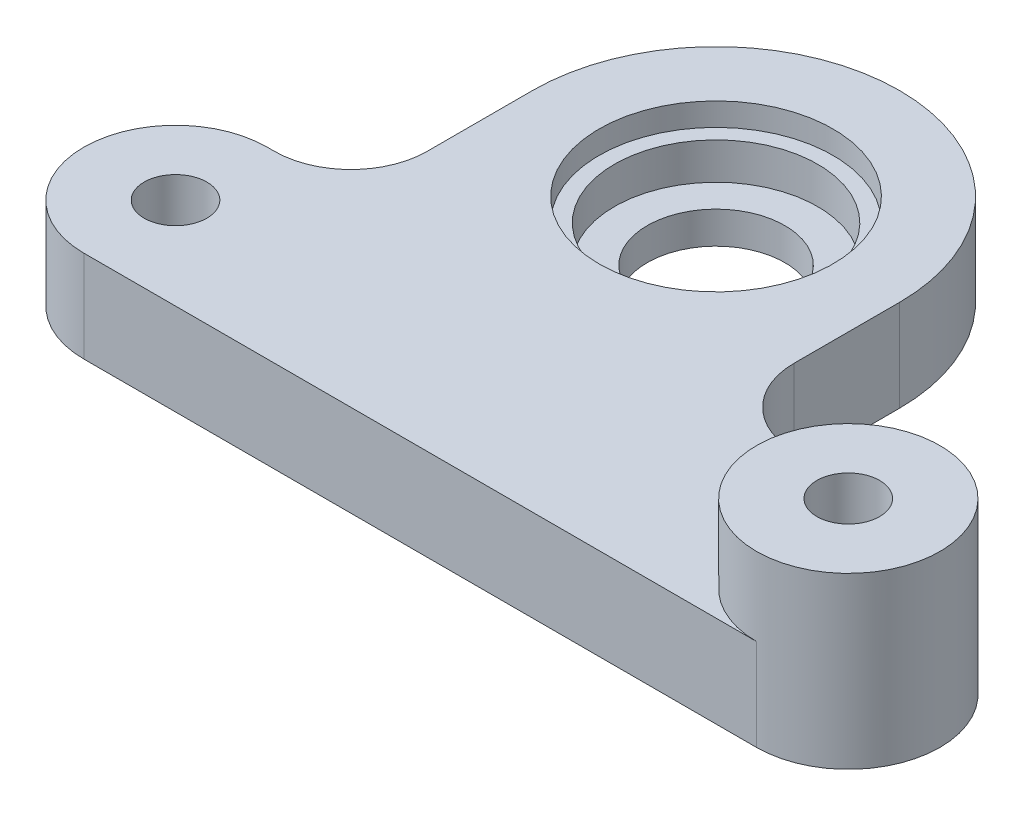
ISO-10303-21;
HEADER;
FILE_DESCRIPTION(('STEP AP214'),'2;1');
FILE_NAME('part.step','',(''),(''),'','','');
FILE_SCHEMA(('AUTOMOTIVE_DESIGN { 1 0 10303 214 1 1 1 1 }'));
ENDSEC;
DATA;
#1=APPLICATION_CONTEXT('core data for automotive mechanical design processes');
#2=APPLICATION_PROTOCOL_DEFINITION('international standard','automotive_design',2000,#1);
#3=PRODUCT_CONTEXT('',#1,'mechanical');
#4=PRODUCT('Part','Part','',(#3));
#5=PRODUCT_RELATED_PRODUCT_CATEGORY('part','',(#4));
#6=PRODUCT_DEFINITION_FORMATION('','',#4);
#7=PRODUCT_DEFINITION_CONTEXT('part definition',#1,'design');
#8=PRODUCT_DEFINITION('design','',#6,#7);
#9=PRODUCT_DEFINITION_SHAPE('','',#8);
#10=(LENGTH_UNIT() NAMED_UNIT(*) SI_UNIT(.MILLI.,.METRE.));
#11=(NAMED_UNIT(*) PLANE_ANGLE_UNIT() SI_UNIT($,.RADIAN.));
#12=(NAMED_UNIT(*) SI_UNIT($,.STERADIAN.) SOLID_ANGLE_UNIT());
#13=UNCERTAINTY_MEASURE_WITH_UNIT(LENGTH_MEASURE(1.E-05),#10,'distance_accuracy_value','');
#14=(GEOMETRIC_REPRESENTATION_CONTEXT(3) GLOBAL_UNCERTAINTY_ASSIGNED_CONTEXT((#13)) GLOBAL_UNIT_ASSIGNED_CONTEXT((#10,
#11,#12)) REPRESENTATION_CONTEXT('',''));
#15=CARTESIAN_POINT('',(0.,0.,0.));
#16=DIRECTION('',(0.,0.,1.));
#17=DIRECTION('',(1.,0.,0.));
#18=AXIS2_PLACEMENT_3D('',#15,#16,#17);
#19=CARTESIAN_POINT('',(3.29754031867881,2.1,-13.7904070793871));
#20=DIRECTION('',(0.,1.,0.));
#21=DIRECTION('',(0.,0.,1.));
#22=AXIS2_PLACEMENT_3D('',#19,#20,#21);
#23=CYLINDRICAL_SURFACE('',#22,6.65);
#24=CARTESIAN_POINT('',(3.29754031867881,2.1,-13.7904070793871));
#25=DIRECTION('',(0.,1.,0.));
#26=DIRECTION('',(0.,0.,1.));
#27=AXIS2_PLACEMENT_3D('',#24,#25,#26);
#28=CIRCLE('',#27,6.65);
#29=CARTESIAN_POINT('',(3.29754031867881,2.1,-7.14040707938713));
#30=VERTEX_POINT('',#29);
#31=EDGE_CURVE('E197',#30,#30,#28,.T.);
#32=ORIENTED_EDGE('',*,*,#31,.F.);
#33=EDGE_LOOP('',(#32));
#34=FACE_BOUND('',#33,.T.);
#35=CARTESIAN_POINT('',(3.29754031867881,4.5,-13.7904070793871));
#36=DIRECTION('',(0.,1.,0.));
#37=DIRECTION('',(0.,0.,1.));
#38=AXIS2_PLACEMENT_3D('',#35,#36,#37);
#39=CIRCLE('',#38,6.65);
#40=CARTESIAN_POINT('',(3.29754031867881,4.5,-7.14040707938713));
#41=VERTEX_POINT('',#40);
#42=EDGE_CURVE('E39',#41,#41,#39,.F.);
#43=ORIENTED_EDGE('',*,*,#42,.F.);
#44=EDGE_LOOP('',(#43));
#45=FACE_BOUND('',#44,.T.);
#46=ADVANCED_FACE('F35',(#34,#45),#23,.F.);
#47=CARTESIAN_POINT('',(3.29754031867881,6.,-13.7904070793871));
#48=DIRECTION('',(0.,-1.,0.));
#49=DIRECTION('',(0.,0.,-1.));
#50=AXIS2_PLACEMENT_3D('',#47,#48,#49);
#51=CYLINDRICAL_SURFACE('',#50,4.5);
#52=CARTESIAN_POINT('',(3.29754031867881,0.,-13.7904070793871));
#53=DIRECTION('',(0.,1.,0.));
#54=DIRECTION('',(0.,0.,1.));
#55=AXIS2_PLACEMENT_3D('',#52,#53,#54);
#56=CIRCLE('',#55,4.5);
#57=CARTESIAN_POINT('',(3.29754031867881,0.,-9.29040707938713));
#58=VERTEX_POINT('',#57);
#59=EDGE_CURVE('E152',#58,#58,#56,.T.);
#60=ORIENTED_EDGE('',*,*,#59,.F.);
#61=EDGE_LOOP('',(#60));
#62=FACE_BOUND('',#61,.T.);
#63=CARTESIAN_POINT('',(3.29754031867881,2.1,-13.7904070793871));
#64=DIRECTION('',(0.,1.,0.));
#65=DIRECTION('',(0.,0.,1.));
#66=AXIS2_PLACEMENT_3D('',#63,#64,#65);
#67=CIRCLE('',#66,4.5);
#68=CARTESIAN_POINT('',(3.29754031867881,2.1,-9.29040707938713));
#69=VERTEX_POINT('',#68);
#70=EDGE_CURVE('E194',#69,#69,#67,.T.);
#71=ORIENTED_EDGE('',*,*,#70,.T.);
#72=EDGE_LOOP('',(#71));
#73=FACE_BOUND('',#72,.T.);
#74=ADVANCED_FACE('F263',(#62,#73),#51,.F.);
#75=CARTESIAN_POINT('',(-14.1683687722303,6.,4.09651606653429));
#76=DIRECTION('',(0.,-1.,0.));
#77=DIRECTION('',(0.,0.,-1.));
#78=AXIS2_PLACEMENT_3D('',#75,#76,#77);
#79=CYLINDRICAL_SURFACE('',#78,2.05);
#80=CARTESIAN_POINT('',(-14.1683687722303,6.,4.09651606653429));
#81=DIRECTION('',(0.,1.,0.));
#82=DIRECTION('',(0.,0.,1.));
#83=AXIS2_PLACEMENT_3D('',#80,#81,#82);
#84=CIRCLE('',#83,2.05);
#85=CARTESIAN_POINT('',(-14.1683687722303,6.,6.14651606653429));
#86=VERTEX_POINT('',#85);
#87=EDGE_CURVE('E193',#86,#86,#84,.T.);
#88=ORIENTED_EDGE('',*,*,#87,.T.);
#89=EDGE_LOOP('',(#88));
#90=FACE_BOUND('',#89,.T.);
#91=CARTESIAN_POINT('',(-14.1683687722303,2.,4.09651606653429));
#92=DIRECTION('',(0.,-1.,0.));
#93=DIRECTION('',(0.,0.,-1.));
#94=AXIS2_PLACEMENT_3D('',#91,#92,#93);
#95=CIRCLE('',#94,2.05);
#96=CARTESIAN_POINT('',(-14.1683687722303,2.,2.04651606653429));
#97=VERTEX_POINT('',#96);
#98=EDGE_CURVE('E190',#97,#97,#95,.T.);
#99=ORIENTED_EDGE('',*,*,#98,.T.);
#100=EDGE_LOOP('',(#99));
#101=FACE_BOUND('',#100,.T.);
#102=ADVANCED_FACE('F269',(#90,#101),#79,.F.);
#103=CARTESIAN_POINT('',(29.8316312277697,6.,4.09651606653429));
#104=DIRECTION('',(0.,-1.,0.));
#105=DIRECTION('',(0.,0.,-1.));
#106=AXIS2_PLACEMENT_3D('',#103,#104,#105);
#107=CYLINDRICAL_SURFACE('',#106,2.04999999999999);
#108=CARTESIAN_POINT('',(29.8316312277697,2.,4.09651606653429));
#109=DIRECTION('',(0.,-1.,0.));
#110=DIRECTION('',(0.,0.,-1.));
#111=AXIS2_PLACEMENT_3D('',#108,#109,#110);
#112=CIRCLE('',#111,2.04999999999999);
#113=CARTESIAN_POINT('',(29.8316312277697,2.,2.0465160665343));
#114=VERTEX_POINT('',#113);
#115=EDGE_CURVE('E187',#114,#114,#112,.T.);
#116=ORIENTED_EDGE('',*,*,#115,.T.);
#117=EDGE_LOOP('',(#116));
#118=FACE_BOUND('',#117,.T.);
#119=CARTESIAN_POINT('',(29.8316312277697,11.1,4.09651606653429));
#120=DIRECTION('',(0.,1.,0.));
#121=DIRECTION('',(0.,0.,1.));
#122=AXIS2_PLACEMENT_3D('',#119,#120,#121);
#123=CIRCLE('',#122,2.04999999999999);
#124=CARTESIAN_POINT('',(29.8316312277697,11.1,6.14651606653427));
#125=VERTEX_POINT('',#124);
#126=EDGE_CURVE('E461',#125,#125,#123,.T.);
#127=ORIENTED_EDGE('',*,*,#126,.T.);
#128=EDGE_LOOP('',(#127));
#129=FACE_BOUND('',#128,.T.);
#130=ADVANCED_FACE('F288',(#118,#129),#107,.F.);
#131=CARTESIAN_POINT('',(-14.1683687722303,6.,4.09651606653429));
#132=DIRECTION('',(0.,1.,0.));
#133=DIRECTION('',(0.,0.,1.));
#134=AXIS2_PLACEMENT_3D('',#131,#132,#133);
#135=PLANE('',#134);
#136=CARTESIAN_POINT('',(29.8316312277697,6.,4.09651606653429));
#137=DIRECTION('',(0.,1.,0.));
#138=DIRECTION('',(0.,0.,1.));
#139=AXIS2_PLACEMENT_3D('',#136,#137,#138);
#140=CIRCLE('',#139,5.99999999999999);
#141=CARTESIAN_POINT('',(29.8316312277697,6.,-1.90348393346571));
#142=VERTEX_POINT('',#141);
#143=CARTESIAN_POINT('',(29.8316312277697,6.,10.0965160665343));
#144=VERTEX_POINT('',#143);
#145=EDGE_CURVE('E11',#142,#144,#140,.T.);
#146=ORIENTED_EDGE('',*,*,#145,.F.);
#147=DIRECTION('',(-1.,0.,0.));
#148=VECTOR('',#147,1.);
#149=CARTESIAN_POINT('',(20.2975403186788,6.,-1.90348393346571));
#150=LINE('',#149,#148);
#151=CARTESIAN_POINT('',(20.2975403186788,6.,-1.90348393346571));
#152=VERTEX_POINT('',#151);
#153=EDGE_CURVE('E226',#142,#152,#150,.T.);
#154=ORIENTED_EDGE('',*,*,#153,.T.);
#155=CARTESIAN_POINT('',(20.2975403186788,6.,-6.90348393346571));
#156=DIRECTION('',(0.,-1.,0.));
#157=DIRECTION('',(0.,0.,-1.));
#158=AXIS2_PLACEMENT_3D('',#155,#156,#157);
#159=CIRCLE('',#158,5.);
#160=CARTESIAN_POINT('',(15.2975403186788,6.,-6.90348393346571));
#161=VERTEX_POINT('',#160);
#162=EDGE_CURVE('E228',#152,#161,#159,.T.);
#163=ORIENTED_EDGE('',*,*,#162,.T.);
#164=DIRECTION('',(0.,0.,-1.));
#165=VECTOR('',#164,1.);
#166=CARTESIAN_POINT('',(15.2975403186788,6.,-13.7904070793871));
#167=LINE('',#166,#165);
#168=CARTESIAN_POINT('',(15.2975403186788,6.,-13.7904070793871));
#169=VERTEX_POINT('',#168);
#170=EDGE_CURVE('E230',#161,#169,#167,.T.);
#171=ORIENTED_EDGE('',*,*,#170,.T.);
#172=CARTESIAN_POINT('',(3.29754031867881,6.,-13.7904070793871));
#173=DIRECTION('',(0.,1.,0.));
#174=DIRECTION('',(0.,0.,1.));
#175=AXIS2_PLACEMENT_3D('',#172,#173,#174);
#176=CIRCLE('',#175,12.);
#177=CARTESIAN_POINT('',(-8.70245968132119,6.,-13.7904070793871));
#178=VERTEX_POINT('',#177);
#179=EDGE_CURVE('E130',#169,#178,#176,.T.);
#180=ORIENTED_EDGE('',*,*,#179,.T.);
#181=DIRECTION('',(0.,0.,1.));
#182=VECTOR('',#181,1.);
#183=CARTESIAN_POINT('',(-8.70245968132119,6.,-13.7904070793871));
#184=LINE('',#183,#182);
#185=CARTESIAN_POINT('',(-8.70245968132119,6.,-6.90348393346571));
#186=VERTEX_POINT('',#185);
#187=EDGE_CURVE('E123',#178,#186,#184,.T.);
#188=ORIENTED_EDGE('',*,*,#187,.T.);
#189=CARTESIAN_POINT('',(-13.7024596813212,6.,-6.90348393346571));
#190=DIRECTION('',(0.,-1.,0.));
#191=DIRECTION('',(0.,0.,-1.));
#192=AXIS2_PLACEMENT_3D('',#189,#190,#191);
#193=CIRCLE('',#192,5.);
#194=CARTESIAN_POINT('',(-13.7024596813212,6.,-1.90348393346571));
#195=VERTEX_POINT('',#194);
#196=EDGE_CURVE('E128',#186,#195,#193,.T.);
#197=ORIENTED_EDGE('',*,*,#196,.T.);
#198=DIRECTION('',(-1.,0.,0.));
#199=VECTOR('',#198,1.);
#200=CARTESIAN_POINT('',(-13.7024596813212,6.,-1.90348393346571));
#201=LINE('',#200,#199);
#202=CARTESIAN_POINT('',(-14.1683687722303,6.,-1.90348393346571));
#203=VERTEX_POINT('',#202);
#204=EDGE_CURVE('E54',#195,#203,#201,.T.);
#205=ORIENTED_EDGE('',*,*,#204,.T.);
#206=CARTESIAN_POINT('',(-14.1683687722303,6.,4.09651606653429));
#207=DIRECTION('',(0.,1.,0.));
#208=DIRECTION('',(0.,0.,1.));
#209=AXIS2_PLACEMENT_3D('',#206,#207,#208);
#210=CIRCLE('',#209,6.);
#211=CARTESIAN_POINT('',(-14.1683687722303,6.,10.0965160665343));
#212=VERTEX_POINT('',#211);
#213=EDGE_CURVE('E167',#203,#212,#210,.T.);
#214=ORIENTED_EDGE('',*,*,#213,.T.);
#215=DIRECTION('',(1.,0.,0.));
#216=VECTOR('',#215,1.);
#217=CARTESIAN_POINT('',(-14.1683687722303,6.,10.0965160665343));
#218=LINE('',#217,#216);
#219=EDGE_CURVE('E105',#212,#144,#218,.T.);
#220=ORIENTED_EDGE('',*,*,#219,.T.);
#221=EDGE_LOOP('',(#146,#154,#163,#171,#180,#188,#197,#205,#214,#220));
#222=FACE_BOUND('',#221,.T.);
#223=CARTESIAN_POINT('',(3.29754031867881,6.,-13.7904070793871));
#224=DIRECTION('',(0.,1.,0.));
#225=DIRECTION('',(0.,0.,1.));
#226=AXIS2_PLACEMENT_3D('',#223,#224,#225);
#227=CIRCLE('',#226,7.65);
#228=CARTESIAN_POINT('',(3.29754031867881,6.,-6.14040707938713));
#229=VERTEX_POINT('',#228);
#230=EDGE_CURVE('E211',#229,#229,#227,.T.);
#231=ORIENTED_EDGE('',*,*,#230,.F.);
#232=EDGE_LOOP('',(#231));
#233=FACE_BOUND('',#232,.T.);
#234=ORIENTED_EDGE('',*,*,#87,.F.);
#235=EDGE_LOOP('',(#234));
#236=FACE_BOUND('',#235,.T.);
#237=ADVANCED_FACE('F125',(#222,#233,#236),#135,.T.);
#238=CARTESIAN_POINT('',(-14.1683687722303,0.,4.09651606653429));
#239=DIRECTION('',(0.,1.,0.));
#240=DIRECTION('',(0.,0.,1.));
#241=AXIS2_PLACEMENT_3D('',#238,#239,#240);
#242=PLANE('',#241);
#243=CARTESIAN_POINT('',(-14.1683687722303,0.,4.09651606653429));
#244=DIRECTION('',(0.,-1.,0.));
#245=DIRECTION('',(0.,0.,-1.));
#246=AXIS2_PLACEMENT_3D('',#243,#244,#245);
#247=CIRCLE('',#246,4.);
#248=CARTESIAN_POINT('',(-14.1683687722303,0.,0.0965160665342881));
#249=VERTEX_POINT('',#248);
#250=EDGE_CURVE('E215',#249,#249,#247,.T.);
#251=ORIENTED_EDGE('',*,*,#250,.F.);
#252=EDGE_LOOP('',(#251));
#253=FACE_BOUND('',#252,.T.);
#254=CARTESIAN_POINT('',(29.8316312277697,0.,4.09651606653429));
#255=DIRECTION('',(0.,-1.,0.));
#256=DIRECTION('',(0.,0.,-1.));
#257=AXIS2_PLACEMENT_3D('',#254,#255,#256);
#258=CIRCLE('',#257,4.00000000000001);
#259=CARTESIAN_POINT('',(29.8316312277697,0.,0.096516066534282));
#260=VERTEX_POINT('',#259);
#261=EDGE_CURVE('E196',#260,#260,#258,.T.);
#262=ORIENTED_EDGE('',*,*,#261,.F.);
#263=EDGE_LOOP('',(#262));
#264=FACE_BOUND('',#263,.T.);
#265=CARTESIAN_POINT('',(-14.1683687722303,0.,4.09651606653429));
#266=DIRECTION('',(0.,1.,0.));
#267=DIRECTION('',(0.,0.,1.));
#268=AXIS2_PLACEMENT_3D('',#265,#266,#267);
#269=CIRCLE('',#268,6.);
#270=CARTESIAN_POINT('',(-14.1683687722303,0.,-1.90348393346571));
#271=VERTEX_POINT('',#270);
#272=CARTESIAN_POINT('',(-14.1683687722303,0.,10.0965160665343));
#273=VERTEX_POINT('',#272);
#274=EDGE_CURVE('E148',#271,#273,#269,.T.);
#275=ORIENTED_EDGE('',*,*,#274,.F.);
#276=DIRECTION('',(-1.,0.,0.));
#277=VECTOR('',#276,1.);
#278=CARTESIAN_POINT('',(-13.7024596813212,0.,-1.90348393346571));
#279=LINE('',#278,#277);
#280=CARTESIAN_POINT('',(-13.7024596813212,0.,-1.90348393346571));
#281=VERTEX_POINT('',#280);
#282=EDGE_CURVE('E96',#281,#271,#279,.T.);
#283=ORIENTED_EDGE('',*,*,#282,.F.);
#284=CARTESIAN_POINT('',(-13.7024596813212,0.,-6.90348393346571));
#285=DIRECTION('',(0.,-1.,0.));
#286=DIRECTION('',(0.,0.,-1.));
#287=AXIS2_PLACEMENT_3D('',#284,#285,#286);
#288=CIRCLE('',#287,5.);
#289=CARTESIAN_POINT('',(-8.70245968132119,0.,-6.90348393346571));
#290=VERTEX_POINT('',#289);
#291=EDGE_CURVE('E90',#290,#281,#288,.T.);
#292=ORIENTED_EDGE('',*,*,#291,.F.);
#293=DIRECTION('',(0.,0.,1.));
#294=VECTOR('',#293,1.);
#295=CARTESIAN_POINT('',(-8.70245968132119,0.,-13.7904070793871));
#296=LINE('',#295,#294);
#297=CARTESIAN_POINT('',(-8.70245968132119,0.,-13.7904070793871));
#298=VERTEX_POINT('',#297);
#299=EDGE_CURVE('E138',#298,#290,#296,.T.);
#300=ORIENTED_EDGE('',*,*,#299,.F.);
#301=CARTESIAN_POINT('',(3.29754031867881,0.,-13.7904070793871));
#302=DIRECTION('',(0.,1.,0.));
#303=DIRECTION('',(0.,0.,1.));
#304=AXIS2_PLACEMENT_3D('',#301,#302,#303);
#305=CIRCLE('',#304,12.);
#306=CARTESIAN_POINT('',(15.2975403186788,0.,-13.7904070793871));
#307=VERTEX_POINT('',#306);
#308=EDGE_CURVE('E162',#307,#298,#305,.T.);
#309=ORIENTED_EDGE('',*,*,#308,.F.);
#310=DIRECTION('',(0.,0.,-1.));
#311=VECTOR('',#310,1.);
#312=CARTESIAN_POINT('',(15.2975403186788,0.,-13.7904070793871));
#313=LINE('',#312,#311);
#314=CARTESIAN_POINT('',(15.2975403186788,0.,-6.90348393346571));
#315=VERTEX_POINT('',#314);
#316=EDGE_CURVE('E160',#315,#307,#313,.T.);
#317=ORIENTED_EDGE('',*,*,#316,.F.);
#318=CARTESIAN_POINT('',(20.2975403186788,0.,-6.90348393346571));
#319=DIRECTION('',(0.,-1.,0.));
#320=DIRECTION('',(0.,0.,-1.));
#321=AXIS2_PLACEMENT_3D('',#318,#319,#320);
#322=CIRCLE('',#321,5.);
#323=CARTESIAN_POINT('',(20.2975403186788,0.,-1.90348393346571));
#324=VERTEX_POINT('',#323);
#325=EDGE_CURVE('E158',#324,#315,#322,.T.);
#326=ORIENTED_EDGE('',*,*,#325,.F.);
#327=DIRECTION('',(-1.,0.,0.));
#328=VECTOR('',#327,1.);
#329=CARTESIAN_POINT('',(20.2975403186788,0.,-1.90348393346571));
#330=LINE('',#329,#328);
#331=CARTESIAN_POINT('',(29.8316312277697,0.,-1.90348393346571));
#332=VERTEX_POINT('',#331);
#333=EDGE_CURVE('E156',#332,#324,#330,.T.);
#334=ORIENTED_EDGE('',*,*,#333,.F.);
#335=CARTESIAN_POINT('',(29.8316312277697,0.,4.09651606653429));
#336=DIRECTION('',(0.,1.,0.));
#337=DIRECTION('',(0.,0.,1.));
#338=AXIS2_PLACEMENT_3D('',#335,#336,#337);
#339=CIRCLE('',#338,6.);
#340=CARTESIAN_POINT('',(29.8316312277697,0.,10.0965160665343));
#341=VERTEX_POINT('',#340);
#342=EDGE_CURVE('E154',#341,#332,#339,.T.);
#343=ORIENTED_EDGE('',*,*,#342,.F.);
#344=DIRECTION('',(1.,0.,0.));
#345=VECTOR('',#344,1.);
#346=CARTESIAN_POINT('',(-14.1683687722303,0.,10.0965160665343));
#347=LINE('',#346,#345);
#348=EDGE_CURVE('E151',#273,#341,#347,.T.);
#349=ORIENTED_EDGE('',*,*,#348,.F.);
#350=EDGE_LOOP('',(#275,#283,#292,#300,#309,#317,#326,#334,#343,#349));
#351=FACE_BOUND('',#350,.T.);
#352=ORIENTED_EDGE('',*,*,#59,.T.);
#353=EDGE_LOOP('',(#352));
#354=FACE_BOUND('',#353,.T.);
#355=ADVANCED_FACE('F243',(#253,#264,#351,#354),#242,.F.);
#356=CARTESIAN_POINT('',(-14.1683687722303,6.,4.09651606653429));
#357=DIRECTION('',(0.,-1.,0.));
#358=DIRECTION('',(0.,0.,-1.));
#359=AXIS2_PLACEMENT_3D('',#356,#357,#358);
#360=CYLINDRICAL_SURFACE('',#359,6.);
#361=ORIENTED_EDGE('',*,*,#274,.T.);
#362=DIRECTION('',(0.,-1.,0.));
#363=VECTOR('',#362,1.);
#364=CARTESIAN_POINT('',(-14.1683687722303,6.,10.0965160665343));
#365=LINE('',#364,#363);
#366=EDGE_CURVE('E45',#212,#273,#365,.T.);
#367=ORIENTED_EDGE('',*,*,#366,.F.);
#368=ORIENTED_EDGE('',*,*,#213,.F.);
#369=DIRECTION('',(0.,-1.,0.));
#370=VECTOR('',#369,1.);
#371=CARTESIAN_POINT('',(-14.1683687722303,6.,-1.90348393346571));
#372=LINE('',#371,#370);
#373=EDGE_CURVE('E144',#203,#271,#372,.T.);
#374=ORIENTED_EDGE('',*,*,#373,.T.);
#375=EDGE_LOOP('',(#361,#367,#368,#374));
#376=FACE_BOUND('',#375,.T.);
#377=ADVANCED_FACE('F37',(#376),#360,.T.);
#378=CARTESIAN_POINT('',(-14.1683687722303,6.,10.0965160665343));
#379=DIRECTION('',(0.,0.,-1.));
#380=DIRECTION('',(-1.,0.,0.));
#381=AXIS2_PLACEMENT_3D('',#378,#379,#380);
#382=PLANE('',#381);
#383=ORIENTED_EDGE('',*,*,#348,.T.);
#384=DIRECTION('',(0.,-1.,0.));
#385=VECTOR('',#384,1.);
#386=CARTESIAN_POINT('',(29.8316312277697,6.,10.0965160665343));
#387=LINE('',#386,#385);
#388=EDGE_CURVE('E183',#144,#341,#387,.T.);
#389=ORIENTED_EDGE('',*,*,#388,.F.);
#390=ORIENTED_EDGE('',*,*,#219,.F.);
#391=ORIENTED_EDGE('',*,*,#366,.T.);
#392=EDGE_LOOP('',(#383,#389,#390,#391));
#393=FACE_BOUND('',#392,.T.);
#394=ADVANCED_FACE('F301',(#393),#382,.F.);
#395=CARTESIAN_POINT('',(29.8316312277697,6.,4.09651606653429));
#396=DIRECTION('',(0.,-1.,0.));
#397=DIRECTION('',(0.,0.,-1.));
#398=AXIS2_PLACEMENT_3D('',#395,#396,#397);
#399=CYLINDRICAL_SURFACE('',#398,6.);
#400=ORIENTED_EDGE('',*,*,#342,.T.);
#401=DIRECTION('',(0.,-1.,0.));
#402=VECTOR('',#401,1.);
#403=CARTESIAN_POINT('',(29.8316312277697,6.,-1.90348393346571));
#404=LINE('',#403,#402);
#405=EDGE_CURVE('E180',#142,#332,#404,.T.);
#406=ORIENTED_EDGE('',*,*,#405,.F.);
#407=ORIENTED_EDGE('',*,*,#145,.T.);
#408=ORIENTED_EDGE('',*,*,#388,.T.);
#409=EDGE_LOOP('',(#400,#406,#407,#408));
#410=FACE_BOUND('',#409,.T.);
#411=CARTESIAN_POINT('',(29.8316312277697,11.1,4.09651606653429));
#412=DIRECTION('',(0.,1.,0.));
#413=DIRECTION('',(0.,0.,1.));
#414=AXIS2_PLACEMENT_3D('',#411,#412,#413);
#415=CIRCLE('',#414,5.99999999999999);
#416=CARTESIAN_POINT('',(29.8316312277697,11.1,10.0965160665343));
#417=VERTEX_POINT('',#416);
#418=EDGE_CURVE('E458',#417,#417,#415,.T.);
#419=ORIENTED_EDGE('',*,*,#418,.F.);
#420=EDGE_LOOP('',(#419));
#421=FACE_BOUND('',#420,.T.);
#422=ADVANCED_FACE('F310',(#410,#421),#399,.T.);
#423=CARTESIAN_POINT('',(20.2975403186788,6.,-1.90348393346571));
#424=DIRECTION('',(0.,0.,1.));
#425=DIRECTION('',(1.,0.,0.));
#426=AXIS2_PLACEMENT_3D('',#423,#424,#425);
#427=PLANE('',#426);
#428=ORIENTED_EDGE('',*,*,#333,.T.);
#429=DIRECTION('',(0.,-1.,0.));
#430=VECTOR('',#429,1.);
#431=CARTESIAN_POINT('',(20.2975403186788,6.,-1.90348393346571));
#432=LINE('',#431,#430);
#433=EDGE_CURVE('E177',#152,#324,#432,.T.);
#434=ORIENTED_EDGE('',*,*,#433,.F.);
#435=ORIENTED_EDGE('',*,*,#153,.F.);
#436=ORIENTED_EDGE('',*,*,#405,.T.);
#437=EDGE_LOOP('',(#428,#434,#435,#436));
#438=FACE_BOUND('',#437,.T.);
#439=ADVANCED_FACE('F314',(#438),#427,.F.);
#440=CARTESIAN_POINT('',(20.2975403186788,6.,-6.90348393346571));
#441=DIRECTION('',(0.,-1.,0.));
#442=DIRECTION('',(0.,0.,-1.));
#443=AXIS2_PLACEMENT_3D('',#440,#441,#442);
#444=CYLINDRICAL_SURFACE('',#443,5.);
#445=ORIENTED_EDGE('',*,*,#325,.T.);
#446=DIRECTION('',(0.,-1.,0.));
#447=VECTOR('',#446,1.);
#448=CARTESIAN_POINT('',(15.2975403186788,6.,-6.90348393346571));
#449=LINE('',#448,#447);
#450=EDGE_CURVE('E174',#161,#315,#449,.T.);
#451=ORIENTED_EDGE('',*,*,#450,.F.);
#452=ORIENTED_EDGE('',*,*,#162,.F.);
#453=ORIENTED_EDGE('',*,*,#433,.T.);
#454=EDGE_LOOP('',(#445,#451,#452,#453));
#455=FACE_BOUND('',#454,.T.);
#456=ADVANCED_FACE('F320',(#455),#444,.F.);
#457=CARTESIAN_POINT('',(15.2975403186788,6.,-13.7904070793871));
#458=DIRECTION('',(-1.,0.,0.));
#459=DIRECTION('',(0.,0.,1.));
#460=AXIS2_PLACEMENT_3D('',#457,#458,#459);
#461=PLANE('',#460);
#462=ORIENTED_EDGE('',*,*,#316,.T.);
#463=DIRECTION('',(0.,-1.,0.));
#464=VECTOR('',#463,1.);
#465=CARTESIAN_POINT('',(15.2975403186788,6.,-13.7904070793871));
#466=LINE('',#465,#464);
#467=EDGE_CURVE('E171',#169,#307,#466,.T.);
#468=ORIENTED_EDGE('',*,*,#467,.F.);
#469=ORIENTED_EDGE('',*,*,#170,.F.);
#470=ORIENTED_EDGE('',*,*,#450,.T.);
#471=EDGE_LOOP('',(#462,#468,#469,#470));
#472=FACE_BOUND('',#471,.T.);
#473=ADVANCED_FACE('F236',(#472),#461,.F.);
#474=CARTESIAN_POINT('',(3.29754031867881,6.,-13.7904070793871));
#475=DIRECTION('',(0.,-1.,0.));
#476=DIRECTION('',(0.,0.,-1.));
#477=AXIS2_PLACEMENT_3D('',#474,#475,#476);
#478=CYLINDRICAL_SURFACE('',#477,12.);
#479=ORIENTED_EDGE('',*,*,#308,.T.);
#480=DIRECTION('',(0.,-1.,0.));
#481=VECTOR('',#480,1.);
#482=CARTESIAN_POINT('',(-8.70245968132119,6.,-13.7904070793871));
#483=LINE('',#482,#481);
#484=EDGE_CURVE('E139',#178,#298,#483,.T.);
#485=ORIENTED_EDGE('',*,*,#484,.F.);
#486=ORIENTED_EDGE('',*,*,#179,.F.);
#487=ORIENTED_EDGE('',*,*,#467,.T.);
#488=EDGE_LOOP('',(#479,#485,#486,#487));
#489=FACE_BOUND('',#488,.T.);
#490=ADVANCED_FACE('F240',(#489),#478,.T.);
#491=CARTESIAN_POINT('',(-8.70245968132119,6.,-13.7904070793871));
#492=DIRECTION('',(1.,0.,0.));
#493=DIRECTION('',(0.,0.,-1.));
#494=AXIS2_PLACEMENT_3D('',#491,#492,#493);
#495=PLANE('',#494);
#496=ORIENTED_EDGE('',*,*,#299,.T.);
#497=DIRECTION('',(0.,-1.,0.));
#498=VECTOR('',#497,1.);
#499=CARTESIAN_POINT('',(-8.70245968132119,6.,-6.90348393346571));
#500=LINE('',#499,#498);
#501=EDGE_CURVE('E135',#186,#290,#500,.T.);
#502=ORIENTED_EDGE('',*,*,#501,.F.);
#503=ORIENTED_EDGE('',*,*,#187,.F.);
#504=ORIENTED_EDGE('',*,*,#484,.T.);
#505=EDGE_LOOP('',(#496,#502,#503,#504));
#506=FACE_BOUND('',#505,.T.);
#507=ADVANCED_FACE('F136',(#506),#495,.F.);
#508=CARTESIAN_POINT('',(-13.7024596813212,6.,-6.90348393346571));
#509=DIRECTION('',(0.,-1.,0.));
#510=DIRECTION('',(0.,0.,-1.));
#511=AXIS2_PLACEMENT_3D('',#508,#509,#510);
#512=CYLINDRICAL_SURFACE('',#511,5.);
#513=ORIENTED_EDGE('',*,*,#291,.T.);
#514=DIRECTION('',(0.,-1.,0.));
#515=VECTOR('',#514,1.);
#516=CARTESIAN_POINT('',(-13.7024596813212,6.,-1.90348393346571));
#517=LINE('',#516,#515);
#518=EDGE_CURVE('E140',#195,#281,#517,.T.);
#519=ORIENTED_EDGE('',*,*,#518,.F.);
#520=ORIENTED_EDGE('',*,*,#196,.F.);
#521=ORIENTED_EDGE('',*,*,#501,.T.);
#522=EDGE_LOOP('',(#513,#519,#520,#521));
#523=FACE_BOUND('',#522,.T.);
#524=ADVANCED_FACE('F142',(#523),#512,.F.);
#525=CARTESIAN_POINT('',(-13.7024596813212,6.,-1.90348393346571));
#526=DIRECTION('',(0.,0.,1.));
#527=DIRECTION('',(1.,0.,0.));
#528=AXIS2_PLACEMENT_3D('',#525,#526,#527);
#529=PLANE('',#528);
#530=ORIENTED_EDGE('',*,*,#282,.T.);
#531=ORIENTED_EDGE('',*,*,#373,.F.);
#532=ORIENTED_EDGE('',*,*,#204,.F.);
#533=ORIENTED_EDGE('',*,*,#518,.T.);
#534=EDGE_LOOP('',(#530,#531,#532,#533));
#535=FACE_BOUND('',#534,.T.);
#536=ADVANCED_FACE('F249',(#535),#529,.F.);
#537=CARTESIAN_POINT('',(29.8316312277697,2.,4.09651606653429));
#538=DIRECTION('',(0.,-1.,0.));
#539=DIRECTION('',(0.,0.,-1.));
#540=AXIS2_PLACEMENT_3D('',#537,#538,#539);
#541=CYLINDRICAL_SURFACE('',#540,4.00000000000001);
#542=CARTESIAN_POINT('',(29.8316312277697,2.,4.09651606653429));
#543=DIRECTION('',(0.,-1.,0.));
#544=DIRECTION('',(0.,0.,-1.));
#545=AXIS2_PLACEMENT_3D('',#542,#543,#544);
#546=CIRCLE('',#545,4.00000000000001);
#547=CARTESIAN_POINT('',(29.8316312277697,2.,0.096516066534282));
#548=VERTEX_POINT('',#547);
#549=EDGE_CURVE('E201',#548,#548,#546,.T.);
#550=ORIENTED_EDGE('',*,*,#549,.F.);
#551=EDGE_LOOP('',(#550));
#552=FACE_BOUND('',#551,.T.);
#553=ORIENTED_EDGE('',*,*,#261,.T.);
#554=EDGE_LOOP('',(#553));
#555=FACE_BOUND('',#554,.T.);
#556=ADVANCED_FACE('F251',(#552,#555),#541,.F.);
#557=CARTESIAN_POINT('',(29.8316312277697,2.,4.09651606653429));
#558=DIRECTION('',(0.,-1.,0.));
#559=DIRECTION('',(0.,0.,-1.));
#560=AXIS2_PLACEMENT_3D('',#557,#558,#559);
#561=PLANE('',#560);
#562=ORIENTED_EDGE('',*,*,#115,.F.);
#563=EDGE_LOOP('',(#562));
#564=FACE_BOUND('',#563,.T.);
#565=ORIENTED_EDGE('',*,*,#549,.T.);
#566=EDGE_LOOP('',(#565));
#567=FACE_BOUND('',#566,.T.);
#568=ADVANCED_FACE('F257',(#564,#567),#561,.T.);
#569=CARTESIAN_POINT('',(-14.1683687722303,2.,4.09651606653429));
#570=DIRECTION('',(0.,-1.,0.));
#571=DIRECTION('',(0.,0.,-1.));
#572=AXIS2_PLACEMENT_3D('',#569,#570,#571);
#573=CYLINDRICAL_SURFACE('',#572,4.);
#574=CARTESIAN_POINT('',(-14.1683687722303,2.,4.09651606653429));
#575=DIRECTION('',(0.,-1.,0.));
#576=DIRECTION('',(0.,0.,-1.));
#577=AXIS2_PLACEMENT_3D('',#574,#575,#576);
#578=CIRCLE('',#577,4.);
#579=CARTESIAN_POINT('',(-14.1683687722303,2.,0.0965160665342881));
#580=VERTEX_POINT('',#579);
#581=EDGE_CURVE('E191',#580,#580,#578,.T.);
#582=ORIENTED_EDGE('',*,*,#581,.F.);
#583=EDGE_LOOP('',(#582));
#584=FACE_BOUND('',#583,.T.);
#585=ORIENTED_EDGE('',*,*,#250,.T.);
#586=EDGE_LOOP('',(#585));
#587=FACE_BOUND('',#586,.T.);
#588=ADVANCED_FACE('F280',(#584,#587),#573,.F.);
#589=CARTESIAN_POINT('',(-14.1683687722303,2.,4.09651606653429));
#590=DIRECTION('',(0.,-1.,0.));
#591=DIRECTION('',(0.,0.,-1.));
#592=AXIS2_PLACEMENT_3D('',#589,#590,#591);
#593=PLANE('',#592);
#594=ORIENTED_EDGE('',*,*,#98,.F.);
#595=EDGE_LOOP('',(#594));
#596=FACE_BOUND('',#595,.T.);
#597=ORIENTED_EDGE('',*,*,#581,.T.);
#598=EDGE_LOOP('',(#597));
#599=FACE_BOUND('',#598,.T.);
#600=ADVANCED_FACE('F277',(#596,#599),#593,.T.);
#601=CARTESIAN_POINT('',(3.29754031867881,2.1,-13.7904070793871));
#602=DIRECTION('',(0.,1.,0.));
#603=DIRECTION('',(0.,0.,1.));
#604=AXIS2_PLACEMENT_3D('',#601,#602,#603);
#605=PLANE('',#604);
#606=ORIENTED_EDGE('',*,*,#70,.F.);
#607=EDGE_LOOP('',(#606));
#608=FACE_BOUND('',#607,.T.);
#609=ORIENTED_EDGE('',*,*,#31,.T.);
#610=EDGE_LOOP('',(#609));
#611=FACE_BOUND('',#610,.T.);
#612=ADVANCED_FACE('F275',(#608,#611),#605,.T.);
#613=CARTESIAN_POINT('',(3.29754031867881,4.5,-13.7904070793871));
#614=DIRECTION('',(0.,1.,0.));
#615=DIRECTION('',(0.,0.,1.));
#616=AXIS2_PLACEMENT_3D('',#613,#614,#615);
#617=PLANE('',#616);
#618=CARTESIAN_POINT('',(3.29754031867881,4.5,-13.7904070793871));
#619=DIRECTION('',(0.,1.,0.));
#620=DIRECTION('',(0.,0.,1.));
#621=AXIS2_PLACEMENT_3D('',#618,#619,#620);
#622=CIRCLE('',#621,7.65);
#623=CARTESIAN_POINT('',(3.29754031867881,4.5,-6.14040707938713));
#624=VERTEX_POINT('',#623);
#625=EDGE_CURVE('E208',#624,#624,#622,.T.);
#626=ORIENTED_EDGE('',*,*,#625,.T.);
#627=EDGE_LOOP('',(#626));
#628=FACE_BOUND('',#627,.T.);
#629=ORIENTED_EDGE('',*,*,#42,.T.);
#630=EDGE_LOOP('',(#629));
#631=FACE_BOUND('',#630,.T.);
#632=ADVANCED_FACE('F393',(#628,#631),#617,.T.);
#633=CARTESIAN_POINT('',(3.29754031867881,4.5,-13.7904070793871));
#634=DIRECTION('',(0.,1.,0.));
#635=DIRECTION('',(0.,0.,1.));
#636=AXIS2_PLACEMENT_3D('',#633,#634,#635);
#637=CYLINDRICAL_SURFACE('',#636,7.65);
#638=ORIENTED_EDGE('',*,*,#625,.F.);
#639=EDGE_LOOP('',(#638));
#640=FACE_BOUND('',#639,.T.);
#641=ORIENTED_EDGE('',*,*,#230,.T.);
#642=EDGE_LOOP('',(#641));
#643=FACE_BOUND('',#642,.T.);
#644=ADVANCED_FACE('F407',(#640,#643),#637,.F.);
#645=CARTESIAN_POINT('',(29.8316312277697,11.1,4.09651606653429));
#646=DIRECTION('',(0.,1.,0.));
#647=DIRECTION('',(0.,0.,1.));
#648=AXIS2_PLACEMENT_3D('',#645,#646,#647);
#649=PLANE('',#648);
#650=ORIENTED_EDGE('',*,*,#418,.T.);
#651=EDGE_LOOP('',(#650));
#652=FACE_BOUND('',#651,.T.);
#653=ORIENTED_EDGE('',*,*,#126,.F.);
#654=EDGE_LOOP('',(#653));
#655=FACE_BOUND('',#654,.T.);
#656=ADVANCED_FACE('F417',(#652,#655),#649,.T.);
#657=CLOSED_SHELL('',(#46,#74,#102,#130,#237,#355,#377,#394,#422,#439,#456,#473,#490,#507,#524,
#536,#556,#568,#588,#600,#612,#632,#644,#656));
#658=MANIFOLD_SOLID_BREP('B2',#657);
#659=ADVANCED_BREP_SHAPE_REPRESENTATION('',(#18,#658),#14);
#660=SHAPE_DEFINITION_REPRESENTATION(#9,#659);
ENDSEC;
END-ISO-10303-21;
